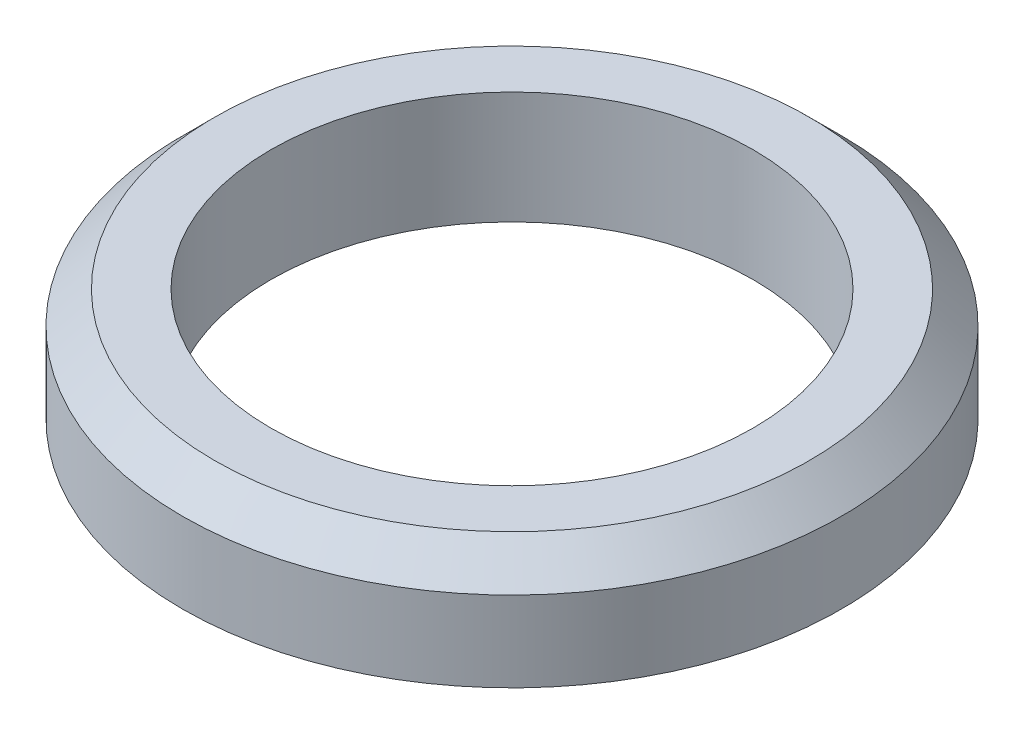
ISO-10303-21;
HEADER;
FILE_DESCRIPTION(('STEP AP214'),'2;1');
FILE_NAME('part.step','',(''),(''),'','','');
FILE_SCHEMA(('AUTOMOTIVE_DESIGN { 1 0 10303 214 1 1 1 1 }'));
ENDSEC;
DATA;
#1=APPLICATION_CONTEXT('core data for automotive mechanical design processes');
#2=APPLICATION_PROTOCOL_DEFINITION('international standard','automotive_design',2000,#1);
#3=PRODUCT_CONTEXT('',#1,'mechanical');
#4=PRODUCT('Part','Part','',(#3));
#5=PRODUCT_RELATED_PRODUCT_CATEGORY('part','',(#4));
#6=PRODUCT_DEFINITION_FORMATION('','',#4);
#7=PRODUCT_DEFINITION_CONTEXT('part definition',#1,'design');
#8=PRODUCT_DEFINITION('design','',#6,#7);
#9=PRODUCT_DEFINITION_SHAPE('','',#8);
#10=(LENGTH_UNIT() NAMED_UNIT(*) SI_UNIT(.MILLI.,.METRE.));
#11=(NAMED_UNIT(*) PLANE_ANGLE_UNIT() SI_UNIT($,.RADIAN.));
#12=(NAMED_UNIT(*) SI_UNIT($,.STERADIAN.) SOLID_ANGLE_UNIT());
#13=UNCERTAINTY_MEASURE_WITH_UNIT(LENGTH_MEASURE(1.E-05),#10,'distance_accuracy_value','');
#14=(GEOMETRIC_REPRESENTATION_CONTEXT(3) GLOBAL_UNCERTAINTY_ASSIGNED_CONTEXT((#13)) GLOBAL_UNIT_ASSIGNED_CONTEXT((#10,
#11,#12)) REPRESENTATION_CONTEXT('',''));
#15=CARTESIAN_POINT('',(0.,0.,0.));
#16=DIRECTION('',(0.,0.,1.));
#17=DIRECTION('',(1.,0.,0.));
#18=AXIS2_PLACEMENT_3D('',#15,#16,#17);
#19=CARTESIAN_POINT('',(0.,7.,0.));
#20=DIRECTION('',(0.,1.,0.));
#21=DIRECTION('',(0.,0.,1.));
#22=AXIS2_PLACEMENT_3D('',#19,#20,#21);
#23=PLANE('',#22);
#24=CARTESIAN_POINT('',(0.,7.,0.));
#25=DIRECTION('',(0.,1.,0.));
#26=DIRECTION('',(0.,0.,1.));
#27=AXIS2_PLACEMENT_3D('',#24,#25,#26);
#28=CIRCLE('',#27,18.5);
#29=CARTESIAN_POINT('',(0.,7.,18.5));
#30=VERTEX_POINT('',#29);
#31=EDGE_CURVE('E53',#30,#30,#28,.T.);
#32=ORIENTED_EDGE('',*,*,#31,.T.);
#33=EDGE_LOOP('',(#32));
#34=FACE_BOUND('',#33,.T.);
#35=CARTESIAN_POINT('',(0.,7.,0.));
#36=DIRECTION('',(0.,1.,0.));
#37=DIRECTION('',(0.,0.,1.));
#38=AXIS2_PLACEMENT_3D('',#35,#36,#37);
#39=CIRCLE('',#38,15.);
#40=CARTESIAN_POINT('',(0.,7.,15.));
#41=VERTEX_POINT('',#40);
#42=EDGE_CURVE('E63',#41,#41,#39,.T.);
#43=ORIENTED_EDGE('',*,*,#42,.F.);
#44=EDGE_LOOP('',(#43));
#45=FACE_BOUND('',#44,.T.);
#46=ADVANCED_FACE('F44',(#34,#45),#23,.T.);
#47=CARTESIAN_POINT('',(0.,0.,0.));
#48=DIRECTION('',(0.,1.,0.));
#49=DIRECTION('',(0.,0.,1.));
#50=AXIS2_PLACEMENT_3D('',#47,#48,#49);
#51=PLANE('',#50);
#52=CARTESIAN_POINT('',(0.,0.,0.));
#53=DIRECTION('',(0.,1.,0.));
#54=DIRECTION('',(0.,0.,1.));
#55=AXIS2_PLACEMENT_3D('',#52,#53,#54);
#56=CIRCLE('',#55,20.5);
#57=CARTESIAN_POINT('',(0.,0.,20.5));
#58=VERTEX_POINT('',#57);
#59=EDGE_CURVE('E58',#58,#58,#56,.T.);
#60=ORIENTED_EDGE('',*,*,#59,.F.);
#61=EDGE_LOOP('',(#60));
#62=FACE_BOUND('',#61,.T.);
#63=CARTESIAN_POINT('',(0.,0.,0.));
#64=DIRECTION('',(0.,1.,0.));
#65=DIRECTION('',(0.,0.,1.));
#66=AXIS2_PLACEMENT_3D('',#63,#64,#65);
#67=CIRCLE('',#66,15.);
#68=CARTESIAN_POINT('',(0.,0.,15.));
#69=VERTEX_POINT('',#68);
#70=EDGE_CURVE('E66',#69,#69,#67,.T.);
#71=ORIENTED_EDGE('',*,*,#70,.T.);
#72=EDGE_LOOP('',(#71));
#73=FACE_BOUND('',#72,.T.);
#74=ADVANCED_FACE('F78',(#62,#73),#51,.F.);
#75=CARTESIAN_POINT('',(0.,7.,0.));
#76=DIRECTION('',(0.,-1.,0.));
#77=DIRECTION('',(0.,0.,-1.));
#78=AXIS2_PLACEMENT_3D('',#75,#76,#77);
#79=CYLINDRICAL_SURFACE('',#78,20.5);
#80=CARTESIAN_POINT('',(0.,4.99999999999998,0.));
#81=DIRECTION('',(0.,1.,0.));
#82=DIRECTION('',(0.,0.,1.));
#83=AXIS2_PLACEMENT_3D('',#80,#81,#82);
#84=CIRCLE('',#83,20.5);
#85=CARTESIAN_POINT('',(0.,4.99999999999998,20.5));
#86=VERTEX_POINT('',#85);
#87=EDGE_CURVE('E10',#86,#86,#84,.F.);
#88=ORIENTED_EDGE('',*,*,#87,.T.);
#89=EDGE_LOOP('',(#88));
#90=FACE_BOUND('',#89,.T.);
#91=ORIENTED_EDGE('',*,*,#59,.T.);
#92=EDGE_LOOP('',(#91));
#93=FACE_BOUND('',#92,.T.);
#94=ADVANCED_FACE('F83',(#90,#93),#79,.T.);
#95=CARTESIAN_POINT('',(0.,7.,0.));
#96=DIRECTION('',(0.,-1.,0.));
#97=DIRECTION('',(0.,0.,-1.));
#98=AXIS2_PLACEMENT_3D('',#95,#96,#97);
#99=CYLINDRICAL_SURFACE('',#98,15.);
#100=ORIENTED_EDGE('',*,*,#42,.T.);
#101=EDGE_LOOP('',(#100));
#102=FACE_BOUND('',#101,.T.);
#103=ORIENTED_EDGE('',*,*,#70,.F.);
#104=EDGE_LOOP('',(#103));
#105=FACE_BOUND('',#104,.T.);
#106=ADVANCED_FACE('F74',(#102,#105),#99,.F.);
#107=CARTESIAN_POINT('',(0.,7.,0.));
#108=DIRECTION('',(0.,-1.,0.));
#109=DIRECTION('',(0.,0.,-1.));
#110=AXIS2_PLACEMENT_3D('',#107,#108,#109);
#111=CONICAL_SURFACE('',#110,18.5,0.785398163397446);
#112=ORIENTED_EDGE('',*,*,#87,.F.);
#113=EDGE_LOOP('',(#112));
#114=FACE_BOUND('',#113,.T.);
#115=ORIENTED_EDGE('',*,*,#31,.F.);
#116=EDGE_LOOP('',(#115));
#117=FACE_BOUND('',#116,.T.);
#118=ADVANCED_FACE('F47',(#114,#117),#111,.T.);
#119=CLOSED_SHELL('',(#46,#74,#94,#106,#118));
#120=MANIFOLD_SOLID_BREP('B2',#119);
#121=ADVANCED_BREP_SHAPE_REPRESENTATION('',(#18,#120),#14);
#122=SHAPE_DEFINITION_REPRESENTATION(#9,#121);
ENDSEC;
END-ISO-10303-21;
